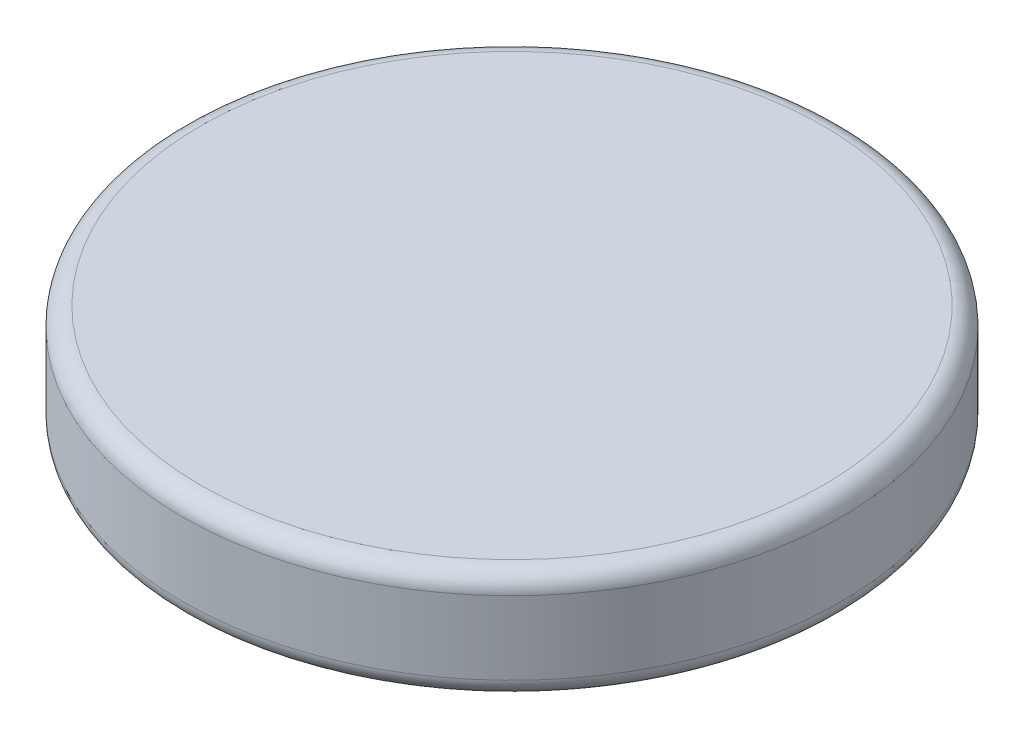
ISO-10303-21;
HEADER;
FILE_DESCRIPTION(('STEP AP214'),'2;1');
FILE_NAME('part.step','',(''),(''),'','','');
FILE_SCHEMA(('AUTOMOTIVE_DESIGN { 1 0 10303 214 1 1 1 1 }'));
ENDSEC;
DATA;
#1=APPLICATION_CONTEXT('core data for automotive mechanical design processes');
#2=APPLICATION_PROTOCOL_DEFINITION('international standard','automotive_design',2000,#1);
#3=PRODUCT_CONTEXT('',#1,'mechanical');
#4=PRODUCT('Part','Part','',(#3));
#5=PRODUCT_RELATED_PRODUCT_CATEGORY('part','',(#4));
#6=PRODUCT_DEFINITION_FORMATION('','',#4);
#7=PRODUCT_DEFINITION_CONTEXT('part definition',#1,'design');
#8=PRODUCT_DEFINITION('design','',#6,#7);
#9=PRODUCT_DEFINITION_SHAPE('','',#8);
#10=(LENGTH_UNIT() NAMED_UNIT(*) SI_UNIT(.MILLI.,.METRE.));
#11=(NAMED_UNIT(*) PLANE_ANGLE_UNIT() SI_UNIT($,.RADIAN.));
#12=(NAMED_UNIT(*) SI_UNIT($,.STERADIAN.) SOLID_ANGLE_UNIT());
#13=UNCERTAINTY_MEASURE_WITH_UNIT(LENGTH_MEASURE(1.E-05),#10,'distance_accuracy_value','');
#14=(GEOMETRIC_REPRESENTATION_CONTEXT(3) GLOBAL_UNCERTAINTY_ASSIGNED_CONTEXT((#13)) GLOBAL_UNIT_ASSIGNED_CONTEXT((#10,
#11,#12)) REPRESENTATION_CONTEXT('',''));
#15=CARTESIAN_POINT('',(0.,0.,0.));
#16=DIRECTION('',(0.,0.,1.));
#17=DIRECTION('',(1.,0.,0.));
#18=AXIS2_PLACEMENT_3D('',#15,#16,#17);
#19=CARTESIAN_POINT('',(0.,3.,0.));
#20=DIRECTION('',(0.,-1.,0.));
#21=DIRECTION('',(0.,0.,-1.));
#22=AXIS2_PLACEMENT_3D('',#19,#20,#21);
#23=CYLINDRICAL_SURFACE('',#22,9.);
#24=CARTESIAN_POINT('',(0.,0.5,0.));
#25=DIRECTION('',(0.,1.,0.));
#26=DIRECTION('',(0.,0.,1.));
#27=AXIS2_PLACEMENT_3D('',#24,#25,#26);
#28=CIRCLE('',#27,9.);
#29=CARTESIAN_POINT('',(0.,0.5,9.));
#30=VERTEX_POINT('',#29);
#31=EDGE_CURVE('E44',#30,#30,#28,.T.);
#32=ORIENTED_EDGE('',*,*,#31,.T.);
#33=EDGE_LOOP('',(#32));
#34=FACE_BOUND('',#33,.T.);
#35=CARTESIAN_POINT('',(0.,2.5,0.));
#36=DIRECTION('',(0.,1.,0.));
#37=DIRECTION('',(0.,0.,1.));
#38=AXIS2_PLACEMENT_3D('',#35,#36,#37);
#39=CIRCLE('',#38,9.);
#40=CARTESIAN_POINT('',(0.,2.5,9.));
#41=VERTEX_POINT('',#40);
#42=EDGE_CURVE('E48',#41,#41,#39,.F.);
#43=ORIENTED_EDGE('',*,*,#42,.T.);
#44=EDGE_LOOP('',(#43));
#45=FACE_BOUND('',#44,.T.);
#46=ADVANCED_FACE('F33',(#34,#45),#23,.T.);
#47=CARTESIAN_POINT('',(0.,3.,0.));
#48=DIRECTION('',(0.,1.,0.));
#49=DIRECTION('',(0.,0.,1.));
#50=AXIS2_PLACEMENT_3D('',#47,#48,#49);
#51=PLANE('',#50);
#52=CARTESIAN_POINT('',(0.,3.,0.));
#53=DIRECTION('',(0.,1.,0.));
#54=DIRECTION('',(0.,0.,1.));
#55=AXIS2_PLACEMENT_3D('',#52,#53,#54);
#56=CIRCLE('',#55,8.5);
#57=CARTESIAN_POINT('',(0.,3.,8.5));
#58=VERTEX_POINT('',#57);
#59=EDGE_CURVE('E10',#58,#58,#56,.T.);
#60=ORIENTED_EDGE('',*,*,#59,.T.);
#61=EDGE_LOOP('',(#60));
#62=FACE_BOUND('',#61,.T.);
#63=ADVANCED_FACE('F64',(#62),#51,.T.);
#64=CARTESIAN_POINT('',(0.,0.,0.));
#65=DIRECTION('',(0.,1.,0.));
#66=DIRECTION('',(0.,0.,1.));
#67=AXIS2_PLACEMENT_3D('',#64,#65,#66);
#68=PLANE('',#67);
#69=CARTESIAN_POINT('',(0.,0.,0.));
#70=DIRECTION('',(0.,1.,0.));
#71=DIRECTION('',(0.,0.,1.));
#72=AXIS2_PLACEMENT_3D('',#69,#70,#71);
#73=CIRCLE('',#72,8.5);
#74=CARTESIAN_POINT('',(0.,0.,8.5));
#75=VERTEX_POINT('',#74);
#76=EDGE_CURVE('E40',#75,#75,#73,.F.);
#77=ORIENTED_EDGE('',*,*,#76,.T.);
#78=EDGE_LOOP('',(#77));
#79=FACE_BOUND('',#78,.T.);
#80=ADVANCED_FACE('F61',(#79),#68,.F.);
#81=CARTESIAN_POINT('',(0.,0.5,0.));
#82=DIRECTION('',(0.,1.,0.));
#83=DIRECTION('',(0.,0.,1.));
#84=AXIS2_PLACEMENT_3D('',#81,#82,#83);
#85=TOROIDAL_SURFACE('',#84,8.5,0.5);
#86=ORIENTED_EDGE('',*,*,#76,.F.);
#87=EDGE_LOOP('',(#86));
#88=FACE_BOUND('',#87,.T.);
#89=ORIENTED_EDGE('',*,*,#31,.F.);
#90=EDGE_LOOP('',(#89));
#91=FACE_BOUND('',#90,.T.);
#92=ADVANCED_FACE('F57',(#88,#91),#85,.T.);
#93=CARTESIAN_POINT('',(0.,2.5,0.));
#94=DIRECTION('',(0.,1.,0.));
#95=DIRECTION('',(0.,0.,1.));
#96=AXIS2_PLACEMENT_3D('',#93,#94,#95);
#97=TOROIDAL_SURFACE('',#96,8.5,0.5);
#98=ORIENTED_EDGE('',*,*,#42,.F.);
#99=EDGE_LOOP('',(#98));
#100=FACE_BOUND('',#99,.T.);
#101=ORIENTED_EDGE('',*,*,#59,.F.);
#102=EDGE_LOOP('',(#101));
#103=FACE_BOUND('',#102,.T.);
#104=ADVANCED_FACE('F35',(#100,#103),#97,.T.);
#105=CLOSED_SHELL('',(#46,#63,#80,#92,#104));
#106=MANIFOLD_SOLID_BREP('B2',#105);
#107=ADVANCED_BREP_SHAPE_REPRESENTATION('',(#18,#106),#14);
#108=SHAPE_DEFINITION_REPRESENTATION(#9,#107);
ENDSEC;
END-ISO-10303-21;
